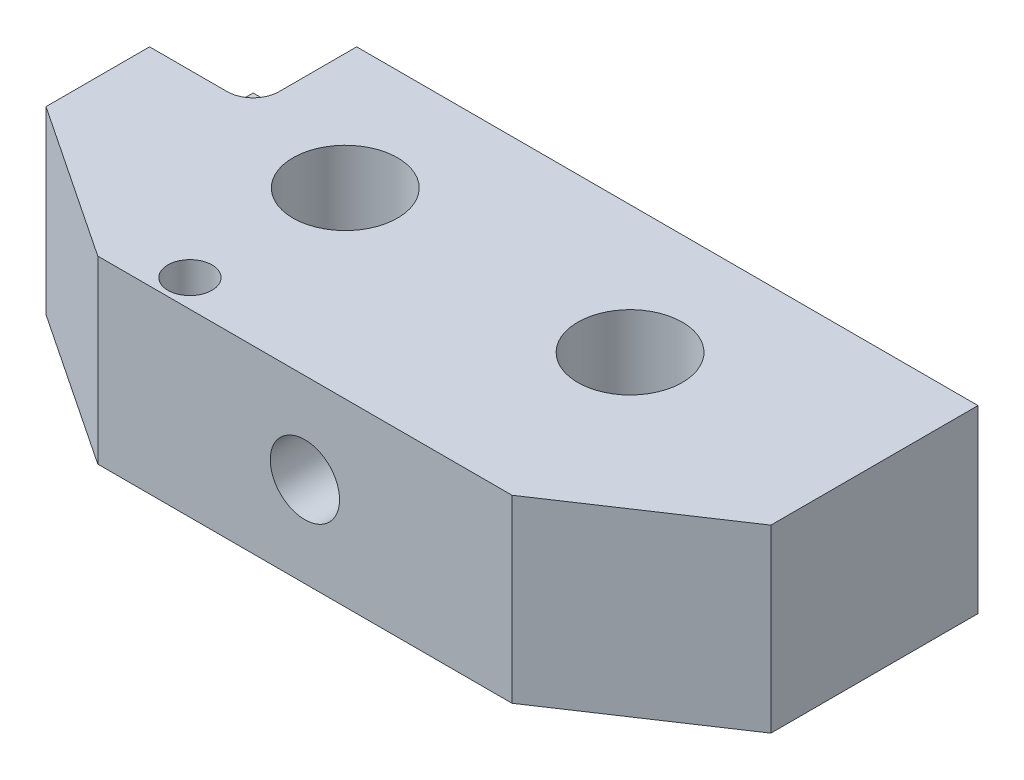
ISO-10303-21;
HEADER;
FILE_DESCRIPTION(('STEP AP214'),'2;1');
FILE_NAME('part.step','',(''),(''),'','','');
FILE_SCHEMA(('AUTOMOTIVE_DESIGN { 1 0 10303 214 1 1 1 1 }'));
ENDSEC;
DATA;
#1=APPLICATION_CONTEXT('core data for automotive mechanical design processes');
#2=APPLICATION_PROTOCOL_DEFINITION('international standard','automotive_design',2000,#1);
#3=PRODUCT_CONTEXT('',#1,'mechanical');
#4=PRODUCT('Part','Part','',(#3));
#5=PRODUCT_RELATED_PRODUCT_CATEGORY('part','',(#4));
#6=PRODUCT_DEFINITION_FORMATION('','',#4);
#7=PRODUCT_DEFINITION_CONTEXT('part definition',#1,'design');
#8=PRODUCT_DEFINITION('design','',#6,#7);
#9=PRODUCT_DEFINITION_SHAPE('','',#8);
#10=(LENGTH_UNIT() NAMED_UNIT(*) SI_UNIT(.MILLI.,.METRE.));
#11=(NAMED_UNIT(*) PLANE_ANGLE_UNIT() SI_UNIT($,.RADIAN.));
#12=(NAMED_UNIT(*) SI_UNIT($,.STERADIAN.) SOLID_ANGLE_UNIT());
#13=UNCERTAINTY_MEASURE_WITH_UNIT(LENGTH_MEASURE(1.E-05),#10,'distance_accuracy_value','');
#14=(GEOMETRIC_REPRESENTATION_CONTEXT(3) GLOBAL_UNCERTAINTY_ASSIGNED_CONTEXT((#13)) GLOBAL_UNIT_ASSIGNED_CONTEXT((#10,
#11,#12)) REPRESENTATION_CONTEXT('',''));
#15=CARTESIAN_POINT('',(0.,0.,0.));
#16=DIRECTION('',(0.,0.,1.));
#17=DIRECTION('',(1.,0.,0.));
#18=AXIS2_PLACEMENT_3D('',#15,#16,#17);
#19=CARTESIAN_POINT('',(44.45,22.098,6.34999999999997));
#20=DIRECTION('',(-1.,0.,0.));
#21=DIRECTION('',(0.,0.,1.));
#22=AXIS2_PLACEMENT_3D('',#19,#20,#21);
#23=PLANE('',#22);
#24=DIRECTION('',(0.,0.,-1.));
#25=VECTOR('',#24,1.);
#26=CARTESIAN_POINT('',(44.45,0.,6.34999999999997));
#27=LINE('',#26,#25);
#28=CARTESIAN_POINT('',(44.45,0.,6.34999999999997));
#29=VERTEX_POINT('',#28);
#30=CARTESIAN_POINT('',(44.45,0.,-19.05));
#31=VERTEX_POINT('',#30);
#32=EDGE_CURVE('E147',#29,#31,#27,.T.);
#33=ORIENTED_EDGE('',*,*,#32,.T.);
#34=DIRECTION('',(0.,-1.,0.));
#35=VECTOR('',#34,1.);
#36=CARTESIAN_POINT('',(44.45,22.098,-19.05));
#37=LINE('',#36,#35);
#38=CARTESIAN_POINT('',(44.45,22.098,-19.05));
#39=VERTEX_POINT('',#38);
#40=EDGE_CURVE('E11',#39,#31,#37,.T.);
#41=ORIENTED_EDGE('',*,*,#40,.F.);
#42=DIRECTION('',(0.,0.,-1.));
#43=VECTOR('',#42,1.);
#44=CARTESIAN_POINT('',(44.45,22.098,6.34999999999997));
#45=LINE('',#44,#43);
#46=CARTESIAN_POINT('',(44.45,22.098,6.34999999999997));
#47=VERTEX_POINT('',#46);
#48=EDGE_CURVE('E166',#47,#39,#45,.T.);
#49=ORIENTED_EDGE('',*,*,#48,.F.);
#50=DIRECTION('',(0.,-1.,0.));
#51=VECTOR('',#50,1.);
#52=CARTESIAN_POINT('',(44.45,22.098,6.34999999999997));
#53=LINE('',#52,#51);
#54=EDGE_CURVE('E143',#47,#29,#53,.T.);
#55=ORIENTED_EDGE('',*,*,#54,.T.);
#56=EDGE_LOOP('',(#33,#41,#49,#55));
#57=FACE_BOUND('',#56,.T.);
#58=ADVANCED_FACE('F48',(#57),#23,.F.);
#59=CARTESIAN_POINT('',(-44.45,22.098,-19.05));
#60=DIRECTION('',(0.,0.,1.));
#61=DIRECTION('',(1.,0.,0.));
#62=AXIS2_PLACEMENT_3D('',#59,#60,#61);
#63=PLANE('',#62);
#64=CARTESIAN_POINT('',(0.,11.049,-19.05));
#65=DIRECTION('',(0.,0.,1.));
#66=DIRECTION('',(1.,0.,0.));
#67=AXIS2_PLACEMENT_3D('',#64,#65,#66);
#68=CIRCLE('',#67,4.24999999999999);
#69=CARTESIAN_POINT('',(4.24999999999999,11.049,-19.05));
#70=VERTEX_POINT('',#69);
#71=EDGE_CURVE('E221',#70,#70,#68,.T.);
#72=ORIENTED_EDGE('',*,*,#71,.T.);
#73=EDGE_LOOP('',(#72));
#74=FACE_BOUND('',#73,.T.);
#75=DIRECTION('',(-1.,0.,0.));
#76=VECTOR('',#75,1.);
#77=CARTESIAN_POINT('',(-44.45,10.8458,-19.05));
#78=LINE('',#77,#76);
#79=CARTESIAN_POINT('',(-31.75,10.8458,-19.05));
#80=VERTEX_POINT('',#79);
#81=CARTESIAN_POINT('',(-44.45,10.8458,-19.05));
#82=VERTEX_POINT('',#81);
#83=EDGE_CURVE('E213',#80,#82,#78,.T.);
#84=ORIENTED_EDGE('',*,*,#83,.F.);
#85=DIRECTION('',(0.,1.,0.));
#86=VECTOR('',#85,1.);
#87=CARTESIAN_POINT('',(-31.75,10.8458,-19.05));
#88=LINE('',#87,#86);
#89=CARTESIAN_POINT('',(-31.75,22.098,-19.05));
#90=VERTEX_POINT('',#89);
#91=EDGE_CURVE('E152',#80,#90,#88,.T.);
#92=ORIENTED_EDGE('',*,*,#91,.T.);
#93=DIRECTION('',(-1.,0.,0.));
#94=VECTOR('',#93,1.);
#95=CARTESIAN_POINT('',(-44.45,22.098,-19.05));
#96=LINE('',#95,#94);
#97=EDGE_CURVE('E107',#39,#90,#96,.T.);
#98=ORIENTED_EDGE('',*,*,#97,.F.);
#99=ORIENTED_EDGE('',*,*,#40,.T.);
#100=DIRECTION('',(-1.,0.,0.));
#101=VECTOR('',#100,1.);
#102=CARTESIAN_POINT('',(-44.45,0.,-19.05));
#103=LINE('',#102,#101);
#104=CARTESIAN_POINT('',(-44.45,0.,-19.05));
#105=VERTEX_POINT('',#104);
#106=EDGE_CURVE('E151',#31,#105,#103,.T.);
#107=ORIENTED_EDGE('',*,*,#106,.T.);
#108=DIRECTION('',(0.,-1.,0.));
#109=VECTOR('',#108,1.);
#110=CARTESIAN_POINT('',(-44.45,22.098,-19.05));
#111=LINE('',#110,#109);
#112=EDGE_CURVE('E56',#82,#105,#111,.T.);
#113=ORIENTED_EDGE('',*,*,#112,.F.);
#114=EDGE_LOOP('',(#84,#92,#98,#99,#107,#113));
#115=FACE_BOUND('',#114,.T.);
#116=ADVANCED_FACE('F182',(#74,#115),#63,.F.);
#117=CARTESIAN_POINT('',(-44.45,22.098,6.35));
#118=DIRECTION('',(1.,0.,0.));
#119=DIRECTION('',(0.,0.,-1.));
#120=AXIS2_PLACEMENT_3D('',#117,#118,#119);
#121=PLANE('',#120);
#122=DIRECTION('',(0.,0.,1.));
#123=VECTOR('',#122,1.);
#124=CARTESIAN_POINT('',(-44.45,22.098,6.35));
#125=LINE('',#124,#123);
#126=CARTESIAN_POINT('',(-44.45,22.098,-6.35));
#127=VERTEX_POINT('',#126);
#128=CARTESIAN_POINT('',(-44.45,22.098,6.35));
#129=VERTEX_POINT('',#128);
#130=EDGE_CURVE('E122',#127,#129,#125,.T.);
#131=ORIENTED_EDGE('',*,*,#130,.F.);
#132=DIRECTION('',(0.,1.,0.));
#133=VECTOR('',#132,1.);
#134=CARTESIAN_POINT('',(-44.45,10.8458,-6.35));
#135=LINE('',#134,#133);
#136=CARTESIAN_POINT('',(-44.45,10.8458,-6.35));
#137=VERTEX_POINT('',#136);
#138=EDGE_CURVE('E63',#137,#127,#135,.T.);
#139=ORIENTED_EDGE('',*,*,#138,.F.);
#140=DIRECTION('',(0.,0.,1.));
#141=VECTOR('',#140,1.);
#142=CARTESIAN_POINT('',(-44.45,10.8458,-6.35));
#143=LINE('',#142,#141);
#144=EDGE_CURVE('E180',#82,#137,#143,.T.);
#145=ORIENTED_EDGE('',*,*,#144,.F.);
#146=ORIENTED_EDGE('',*,*,#112,.T.);
#147=DIRECTION('',(0.,0.,1.));
#148=VECTOR('',#147,1.);
#149=CARTESIAN_POINT('',(-44.45,0.,6.35));
#150=LINE('',#149,#148);
#151=CARTESIAN_POINT('',(-44.45,0.,6.35));
#152=VERTEX_POINT('',#151);
#153=EDGE_CURVE('E156',#105,#152,#150,.T.);
#154=ORIENTED_EDGE('',*,*,#153,.T.);
#155=DIRECTION('',(0.,-1.,0.));
#156=VECTOR('',#155,1.);
#157=CARTESIAN_POINT('',(-44.45,22.098,6.35));
#158=LINE('',#157,#156);
#159=EDGE_CURVE('E136',#129,#152,#158,.T.);
#160=ORIENTED_EDGE('',*,*,#159,.F.);
#161=EDGE_LOOP('',(#131,#139,#145,#146,#154,#160));
#162=FACE_BOUND('',#161,.T.);
#163=ADVANCED_FACE('F176',(#162),#121,.F.);
#164=CARTESIAN_POINT('',(-44.45,22.098,6.35));
#165=DIRECTION('',(0.554700196225229,0.,-0.832050294337844));
#166=DIRECTION('',(-0.832050294337844,0.,-0.554700196225229));
#167=AXIS2_PLACEMENT_3D('',#164,#165,#166);
#168=PLANE('',#167);
#169=DIRECTION('',(0.832050294337844,0.,0.554700196225229));
#170=VECTOR('',#169,1.);
#171=CARTESIAN_POINT('',(-44.45,0.,6.35));
#172=LINE('',#171,#170);
#173=CARTESIAN_POINT('',(-25.4,0.,19.05));
#174=VERTEX_POINT('',#173);
#175=EDGE_CURVE('E132',#152,#174,#172,.T.);
#176=ORIENTED_EDGE('',*,*,#175,.T.);
#177=DIRECTION('',(0.,-1.,0.));
#178=VECTOR('',#177,1.);
#179=CARTESIAN_POINT('',(-25.4,22.098,19.05));
#180=LINE('',#179,#178);
#181=CARTESIAN_POINT('',(-25.4,22.098,19.05));
#182=VERTEX_POINT('',#181);
#183=EDGE_CURVE('E129',#182,#174,#180,.T.);
#184=ORIENTED_EDGE('',*,*,#183,.F.);
#185=DIRECTION('',(0.832050294337844,0.,0.554700196225229));
#186=VECTOR('',#185,1.);
#187=CARTESIAN_POINT('',(-44.45,22.098,6.35));
#188=LINE('',#187,#186);
#189=EDGE_CURVE('E115',#129,#182,#188,.T.);
#190=ORIENTED_EDGE('',*,*,#189,.F.);
#191=ORIENTED_EDGE('',*,*,#159,.T.);
#192=EDGE_LOOP('',(#176,#184,#190,#191));
#193=FACE_BOUND('',#192,.T.);
#194=ADVANCED_FACE('F130',(#193),#168,.F.);
#195=CARTESIAN_POINT('',(-25.4,22.098,19.05));
#196=DIRECTION('',(0.,0.,-1.));
#197=DIRECTION('',(-1.,0.,0.));
#198=AXIS2_PLACEMENT_3D('',#195,#196,#197);
#199=PLANE('',#198);
#200=CARTESIAN_POINT('',(0.,11.049,19.05));
#201=DIRECTION('',(0.,0.,1.));
#202=DIRECTION('',(1.,0.,0.));
#203=AXIS2_PLACEMENT_3D('',#200,#201,#202);
#204=CIRCLE('',#203,4.25);
#205=CARTESIAN_POINT('',(4.25,11.049,19.05));
#206=VERTEX_POINT('',#205);
#207=EDGE_CURVE('E241',#206,#206,#204,.T.);
#208=ORIENTED_EDGE('',*,*,#207,.F.);
#209=EDGE_LOOP('',(#208));
#210=FACE_BOUND('',#209,.T.);
#211=DIRECTION('',(1.,0.,0.));
#212=VECTOR('',#211,1.);
#213=CARTESIAN_POINT('',(-25.4,0.,19.05));
#214=LINE('',#213,#212);
#215=CARTESIAN_POINT('',(25.4,0.,19.05));
#216=VERTEX_POINT('',#215);
#217=EDGE_CURVE('E161',#174,#216,#214,.T.);
#218=ORIENTED_EDGE('',*,*,#217,.T.);
#219=DIRECTION('',(0.,-1.,0.));
#220=VECTOR('',#219,1.);
#221=CARTESIAN_POINT('',(25.4,22.098,19.05));
#222=LINE('',#221,#220);
#223=CARTESIAN_POINT('',(25.4,22.098,19.05));
#224=VERTEX_POINT('',#223);
#225=EDGE_CURVE('E137',#224,#216,#222,.T.);
#226=ORIENTED_EDGE('',*,*,#225,.F.);
#227=DIRECTION('',(1.,0.,0.));
#228=VECTOR('',#227,1.);
#229=CARTESIAN_POINT('',(-25.4,22.098,19.05));
#230=LINE('',#229,#228);
#231=EDGE_CURVE('E119',#182,#224,#230,.T.);
#232=ORIENTED_EDGE('',*,*,#231,.F.);
#233=ORIENTED_EDGE('',*,*,#183,.T.);
#234=EDGE_LOOP('',(#218,#226,#232,#233));
#235=FACE_BOUND('',#234,.T.);
#236=ADVANCED_FACE('F139',(#210,#235),#199,.F.);
#237=CARTESIAN_POINT('',(44.45,22.098,6.34999999999997));
#238=DIRECTION('',(-0.554700196225229,0.,-0.832050294337844));
#239=DIRECTION('',(-0.832050294337844,0.,0.554700196225229));
#240=AXIS2_PLACEMENT_3D('',#237,#238,#239);
#241=PLANE('',#240);
#242=DIRECTION('',(0.832050294337844,0.,-0.554700196225229));
#243=VECTOR('',#242,1.);
#244=CARTESIAN_POINT('',(44.45,0.,6.34999999999997));
#245=LINE('',#244,#243);
#246=EDGE_CURVE('E99',#216,#29,#245,.T.);
#247=ORIENTED_EDGE('',*,*,#246,.T.);
#248=ORIENTED_EDGE('',*,*,#54,.F.);
#249=DIRECTION('',(0.832050294337844,0.,-0.554700196225229));
#250=VECTOR('',#249,1.);
#251=CARTESIAN_POINT('',(44.45,22.098,6.34999999999997));
#252=LINE('',#251,#250);
#253=EDGE_CURVE('E72',#224,#47,#252,.T.);
#254=ORIENTED_EDGE('',*,*,#253,.F.);
#255=ORIENTED_EDGE('',*,*,#225,.T.);
#256=EDGE_LOOP('',(#247,#248,#254,#255));
#257=FACE_BOUND('',#256,.T.);
#258=ADVANCED_FACE('F187',(#257),#241,.F.);
#259=CARTESIAN_POINT('',(0.,22.098,0.));
#260=DIRECTION('',(0.,-1.,0.));
#261=DIRECTION('',(0.,0.,-1.));
#262=AXIS2_PLACEMENT_3D('',#259,#260,#261);
#263=PLANE('',#262);
#264=CARTESIAN_POINT('',(-17.4625,22.098,15.6855455088151));
#265=DIRECTION('',(0.,-1.,0.));
#266=DIRECTION('',(0.,0.,-1.));
#267=AXIS2_PLACEMENT_3D('',#264,#265,#266);
#268=CIRCLE('',#267,2.70509999999999);
#269=CARTESIAN_POINT('',(-17.4625,22.098,12.9804455088151));
#270=VERTEX_POINT('',#269);
#271=EDGE_CURVE('E251',#270,#270,#268,.T.);
#272=ORIENTED_EDGE('',*,*,#271,.T.);
#273=EDGE_LOOP('',(#272));
#274=FACE_BOUND('',#273,.T.);
#275=CARTESIAN_POINT('',(-17.4625,22.098,-3.3644544911849));
#276=DIRECTION('',(0.,1.,0.));
#277=DIRECTION('',(0.,0.,1.));
#278=AXIS2_PLACEMENT_3D('',#275,#276,#277);
#279=CIRCLE('',#278,6.4135);
#280=CARTESIAN_POINT('',(-17.4625,22.098,3.0490455088151));
#281=VERTEX_POINT('',#280);
#282=EDGE_CURVE('E255',#281,#281,#279,.T.);
#283=ORIENTED_EDGE('',*,*,#282,.F.);
#284=EDGE_LOOP('',(#283));
#285=FACE_BOUND('',#284,.T.);
#286=CARTESIAN_POINT('',(17.4625,22.098,-3.3644544911849));
#287=DIRECTION('',(0.,1.,0.));
#288=DIRECTION('',(0.,0.,-1.));
#289=AXIS2_PLACEMENT_3D('',#286,#287,#288);
#290=CIRCLE('',#289,6.4135);
#291=CARTESIAN_POINT('',(17.4625,22.098,-9.7779544911849));
#292=VERTEX_POINT('',#291);
#293=EDGE_CURVE('E250',#292,#292,#290,.T.);
#294=ORIENTED_EDGE('',*,*,#293,.F.);
#295=EDGE_LOOP('',(#294));
#296=FACE_BOUND('',#295,.T.);
#297=ORIENTED_EDGE('',*,*,#97,.T.);
#298=DIRECTION('',(0.,0.,-1.));
#299=VECTOR('',#298,1.);
#300=CARTESIAN_POINT('',(-31.75,22.098,-19.05));
#301=LINE('',#300,#299);
#302=CARTESIAN_POINT('',(-31.75,22.098,-9.52500000000003));
#303=VERTEX_POINT('',#302);
#304=EDGE_CURVE('E209',#303,#90,#301,.T.);
#305=ORIENTED_EDGE('',*,*,#304,.F.);
#306=CARTESIAN_POINT('',(-34.925,22.098,-9.525));
#307=DIRECTION('',(0.,1.,0.));
#308=DIRECTION('',(0.,0.,-1.));
#309=AXIS2_PLACEMENT_3D('',#306,#307,#308);
#310=CIRCLE('',#309,3.175);
#311=CARTESIAN_POINT('',(-34.925,22.098,-6.35));
#312=VERTEX_POINT('',#311);
#313=EDGE_CURVE('E214',#312,#303,#310,.T.);
#314=ORIENTED_EDGE('',*,*,#313,.F.);
#315=DIRECTION('',(1.,0.,0.));
#316=VECTOR('',#315,1.);
#317=CARTESIAN_POINT('',(-34.925,22.098,-6.35));
#318=LINE('',#317,#316);
#319=EDGE_CURVE('E218',#127,#312,#318,.T.);
#320=ORIENTED_EDGE('',*,*,#319,.F.);
#321=ORIENTED_EDGE('',*,*,#130,.T.);
#322=ORIENTED_EDGE('',*,*,#189,.T.);
#323=ORIENTED_EDGE('',*,*,#231,.T.);
#324=ORIENTED_EDGE('',*,*,#253,.T.);
#325=ORIENTED_EDGE('',*,*,#48,.T.);
#326=EDGE_LOOP('',(#297,#305,#314,#320,#321,#322,#323,#324,#325));
#327=FACE_BOUND('',#326,.T.);
#328=ADVANCED_FACE('F117',(#274,#285,#296,#327),#263,.F.);
#329=CARTESIAN_POINT('',(0.,0.,0.));
#330=DIRECTION('',(0.,-1.,0.));
#331=DIRECTION('',(0.,0.,-1.));
#332=AXIS2_PLACEMENT_3D('',#329,#330,#331);
#333=PLANE('',#332);
#334=CARTESIAN_POINT('',(-17.4625,0.,15.6855455088151));
#335=DIRECTION('',(0.,-1.,0.));
#336=DIRECTION('',(0.,0.,-1.));
#337=AXIS2_PLACEMENT_3D('',#334,#335,#336);
#338=CIRCLE('',#337,2.70509999999999);
#339=CARTESIAN_POINT('',(-17.4625,0.,12.9804455088151));
#340=VERTEX_POINT('',#339);
#341=EDGE_CURVE('E265',#340,#340,#338,.T.);
#342=ORIENTED_EDGE('',*,*,#341,.F.);
#343=EDGE_LOOP('',(#342));
#344=FACE_BOUND('',#343,.T.);
#345=CARTESIAN_POINT('',(-17.4625,0.,-3.3644544911849));
#346=DIRECTION('',(0.,1.,0.));
#347=DIRECTION('',(0.,0.,1.));
#348=AXIS2_PLACEMENT_3D('',#345,#346,#347);
#349=CIRCLE('',#348,6.4135);
#350=CARTESIAN_POINT('',(-17.4625,0.,3.0490455088151));
#351=VERTEX_POINT('',#350);
#352=EDGE_CURVE('E245',#351,#351,#349,.T.);
#353=ORIENTED_EDGE('',*,*,#352,.T.);
#354=EDGE_LOOP('',(#353));
#355=FACE_BOUND('',#354,.T.);
#356=CARTESIAN_POINT('',(17.4625,0.,-3.3644544911849));
#357=DIRECTION('',(0.,1.,0.));
#358=DIRECTION('',(0.,0.,-1.));
#359=AXIS2_PLACEMENT_3D('',#356,#357,#358);
#360=CIRCLE('',#359,6.4135);
#361=CARTESIAN_POINT('',(17.4625,0.,-9.7779544911849));
#362=VERTEX_POINT('',#361);
#363=EDGE_CURVE('E246',#362,#362,#360,.T.);
#364=ORIENTED_EDGE('',*,*,#363,.T.);
#365=EDGE_LOOP('',(#364));
#366=FACE_BOUND('',#365,.T.);
#367=ORIENTED_EDGE('',*,*,#32,.F.);
#368=ORIENTED_EDGE('',*,*,#246,.F.);
#369=ORIENTED_EDGE('',*,*,#217,.F.);
#370=ORIENTED_EDGE('',*,*,#175,.F.);
#371=ORIENTED_EDGE('',*,*,#153,.F.);
#372=ORIENTED_EDGE('',*,*,#106,.F.);
#373=EDGE_LOOP('',(#367,#368,#369,#370,#371,#372));
#374=FACE_BOUND('',#373,.T.);
#375=ADVANCED_FACE('F186',(#344,#355,#366,#374),#333,.T.);
#376=CARTESIAN_POINT('',(-31.75,10.8458,-19.05));
#377=DIRECTION('',(1.,0.,0.));
#378=DIRECTION('',(0.,0.,-1.));
#379=AXIS2_PLACEMENT_3D('',#376,#377,#378);
#380=PLANE('',#379);
#381=ORIENTED_EDGE('',*,*,#304,.T.);
#382=ORIENTED_EDGE('',*,*,#91,.F.);
#383=DIRECTION('',(0.,0.,-1.));
#384=VECTOR('',#383,1.);
#385=CARTESIAN_POINT('',(-31.75,10.8458,-19.05));
#386=LINE('',#385,#384);
#387=CARTESIAN_POINT('',(-31.75,10.8458,-9.52500000000003));
#388=VERTEX_POINT('',#387);
#389=EDGE_CURVE('E199',#388,#80,#386,.T.);
#390=ORIENTED_EDGE('',*,*,#389,.F.);
#391=DIRECTION('',(0.,1.,0.));
#392=VECTOR('',#391,1.);
#393=CARTESIAN_POINT('',(-31.75,10.8458,-9.52500000000003));
#394=LINE('',#393,#392);
#395=EDGE_CURVE('E203',#388,#303,#394,.T.);
#396=ORIENTED_EDGE('',*,*,#395,.T.);
#397=EDGE_LOOP('',(#381,#382,#390,#396));
#398=FACE_BOUND('',#397,.T.);
#399=ADVANCED_FACE('F274',(#398),#380,.F.);
#400=CARTESIAN_POINT('',(-34.925,10.8458,-9.525));
#401=DIRECTION('',(0.,1.,0.));
#402=DIRECTION('',(0.,0.,1.));
#403=AXIS2_PLACEMENT_3D('',#400,#401,#402);
#404=CYLINDRICAL_SURFACE('',#403,3.175);
#405=ORIENTED_EDGE('',*,*,#313,.T.);
#406=ORIENTED_EDGE('',*,*,#395,.F.);
#407=CARTESIAN_POINT('',(-34.925,10.8458,-9.525));
#408=DIRECTION('',(0.,1.,0.));
#409=DIRECTION('',(0.,0.,-1.));
#410=AXIS2_PLACEMENT_3D('',#407,#408,#409);
#411=CIRCLE('',#410,3.175);
#412=CARTESIAN_POINT('',(-34.925,10.8458,-6.35));
#413=VERTEX_POINT('',#412);
#414=EDGE_CURVE('E225',#413,#388,#411,.T.);
#415=ORIENTED_EDGE('',*,*,#414,.F.);
#416=DIRECTION('',(0.,1.,0.));
#417=VECTOR('',#416,1.);
#418=CARTESIAN_POINT('',(-34.925,10.8458,-6.35));
#419=LINE('',#418,#417);
#420=EDGE_CURVE('E198',#413,#312,#419,.T.);
#421=ORIENTED_EDGE('',*,*,#420,.T.);
#422=EDGE_LOOP('',(#405,#406,#415,#421));
#423=FACE_BOUND('',#422,.T.);
#424=ADVANCED_FACE('F334',(#423),#404,.F.);
#425=CARTESIAN_POINT('',(-34.925,10.8458,-6.35));
#426=DIRECTION('',(0.,0.,1.));
#427=DIRECTION('',(1.,0.,0.));
#428=AXIS2_PLACEMENT_3D('',#425,#426,#427);
#429=PLANE('',#428);
#430=ORIENTED_EDGE('',*,*,#319,.T.);
#431=ORIENTED_EDGE('',*,*,#420,.F.);
#432=DIRECTION('',(1.,0.,0.));
#433=VECTOR('',#432,1.);
#434=CARTESIAN_POINT('',(-34.925,10.8458,-6.35));
#435=LINE('',#434,#433);
#436=EDGE_CURVE('E229',#137,#413,#435,.T.);
#437=ORIENTED_EDGE('',*,*,#436,.F.);
#438=ORIENTED_EDGE('',*,*,#138,.T.);
#439=EDGE_LOOP('',(#430,#431,#437,#438));
#440=FACE_BOUND('',#439,.T.);
#441=ADVANCED_FACE('F326',(#440),#429,.F.);
#442=CARTESIAN_POINT('',(-34.925,10.8458,-9.525));
#443=DIRECTION('',(0.,-1.,0.));
#444=DIRECTION('',(0.,0.,-1.));
#445=AXIS2_PLACEMENT_3D('',#442,#443,#444);
#446=PLANE('',#445);
#447=ORIENTED_EDGE('',*,*,#83,.T.);
#448=ORIENTED_EDGE('',*,*,#144,.T.);
#449=ORIENTED_EDGE('',*,*,#436,.T.);
#450=ORIENTED_EDGE('',*,*,#414,.T.);
#451=ORIENTED_EDGE('',*,*,#389,.T.);
#452=EDGE_LOOP('',(#447,#448,#449,#450,#451));
#453=FACE_BOUND('',#452,.T.);
#454=ADVANCED_FACE('F320',(#453),#446,.F.);
#455=CARTESIAN_POINT('',(0.,11.049,19.05));
#456=DIRECTION('',(0.,0.,1.));
#457=DIRECTION('',(1.,0.,0.));
#458=AXIS2_PLACEMENT_3D('',#455,#456,#457);
#459=CYLINDRICAL_SURFACE('',#458,4.25);
#460=ORIENTED_EDGE('',*,*,#71,.F.);
#461=EDGE_LOOP('',(#460));
#462=FACE_BOUND('',#461,.T.);
#463=ORIENTED_EDGE('',*,*,#207,.T.);
#464=EDGE_LOOP('',(#463));
#465=FACE_BOUND('',#464,.T.);
#466=ADVANCED_FACE('F284',(#462,#465),#459,.F.);
#467=CARTESIAN_POINT('',(17.4625,0.,-3.3644544911849));
#468=DIRECTION('',(0.,1.,0.));
#469=DIRECTION('',(0.,0.,1.));
#470=AXIS2_PLACEMENT_3D('',#467,#468,#469);
#471=CYLINDRICAL_SURFACE('',#470,6.4135);
#472=ORIENTED_EDGE('',*,*,#363,.F.);
#473=EDGE_LOOP('',(#472));
#474=FACE_BOUND('',#473,.T.);
#475=ORIENTED_EDGE('',*,*,#293,.T.);
#476=EDGE_LOOP('',(#475));
#477=FACE_BOUND('',#476,.T.);
#478=ADVANCED_FACE('F280',(#474,#477),#471,.F.);
#479=CARTESIAN_POINT('',(-17.4625,0.,-3.3644544911849));
#480=DIRECTION('',(0.,1.,0.));
#481=DIRECTION('',(0.,0.,1.));
#482=AXIS2_PLACEMENT_3D('',#479,#480,#481);
#483=CYLINDRICAL_SURFACE('',#482,6.4135);
#484=ORIENTED_EDGE('',*,*,#352,.F.);
#485=EDGE_LOOP('',(#484));
#486=FACE_BOUND('',#485,.T.);
#487=ORIENTED_EDGE('',*,*,#282,.T.);
#488=EDGE_LOOP('',(#487));
#489=FACE_BOUND('',#488,.T.);
#490=ADVANCED_FACE('F283',(#486,#489),#483,.F.);
#491=CARTESIAN_POINT('',(-17.4625,0.,15.6855455088151));
#492=DIRECTION('',(0.,-1.,0.));
#493=DIRECTION('',(0.,0.,-1.));
#494=AXIS2_PLACEMENT_3D('',#491,#492,#493);
#495=CYLINDRICAL_SURFACE('',#494,2.70509999999999);
#496=ORIENTED_EDGE('',*,*,#271,.F.);
#497=EDGE_LOOP('',(#496));
#498=FACE_BOUND('',#497,.T.);
#499=ORIENTED_EDGE('',*,*,#341,.T.);
#500=EDGE_LOOP('',(#499));
#501=FACE_BOUND('',#500,.T.);
#502=ADVANCED_FACE('F270',(#498,#501),#495,.F.);
#503=CLOSED_SHELL('',(#58,#116,#163,#194,#236,#258,#328,#375,#399,#424,#441,#454,#466,#478,#490,#502));
#504=MANIFOLD_SOLID_BREP('B2',#503);
#505=ADVANCED_BREP_SHAPE_REPRESENTATION('',(#18,#504),#14);
#506=SHAPE_DEFINITION_REPRESENTATION(#9,#505);
ENDSEC;
END-ISO-10303-21;
